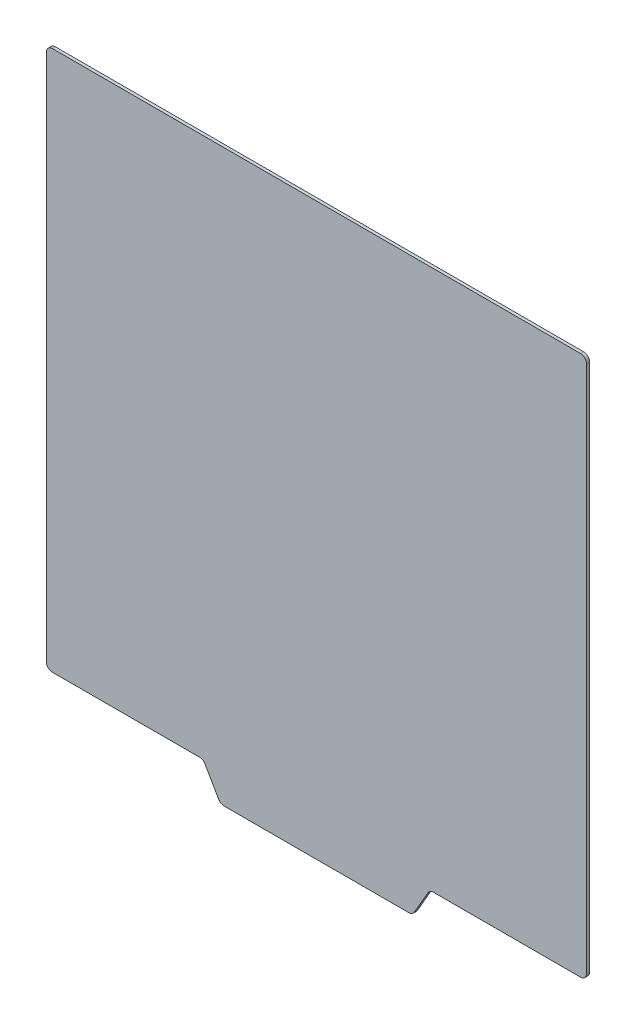
ISO-10303-21;
HEADER;
FILE_DESCRIPTION(('STEP AP214'),'2;1');
FILE_NAME('part.step','',(''),(''),'','','');
FILE_SCHEMA(('AUTOMOTIVE_DESIGN { 1 0 10303 214 1 1 1 1 }'));
ENDSEC;
DATA;
#1=APPLICATION_CONTEXT('core data for automotive mechanical design processes');
#2=APPLICATION_PROTOCOL_DEFINITION('international standard','automotive_design',2000,#1);
#3=PRODUCT_CONTEXT('',#1,'mechanical');
#4=PRODUCT('Part','Part','',(#3));
#5=PRODUCT_RELATED_PRODUCT_CATEGORY('part','',(#4));
#6=PRODUCT_DEFINITION_FORMATION('','',#4);
#7=PRODUCT_DEFINITION_CONTEXT('part definition',#1,'design');
#8=PRODUCT_DEFINITION('design','',#6,#7);
#9=PRODUCT_DEFINITION_SHAPE('','',#8);
#10=(LENGTH_UNIT() NAMED_UNIT(*) SI_UNIT(.MILLI.,.METRE.));
#11=(NAMED_UNIT(*) PLANE_ANGLE_UNIT() SI_UNIT($,.RADIAN.));
#12=(NAMED_UNIT(*) SI_UNIT($,.STERADIAN.) SOLID_ANGLE_UNIT());
#13=UNCERTAINTY_MEASURE_WITH_UNIT(LENGTH_MEASURE(1.E-05),#10,'distance_accuracy_value','');
#14=(GEOMETRIC_REPRESENTATION_CONTEXT(3) GLOBAL_UNCERTAINTY_ASSIGNED_CONTEXT((#13)) GLOBAL_UNIT_ASSIGNED_CONTEXT((#10,
#11,#12)) REPRESENTATION_CONTEXT('',''));
#15=CARTESIAN_POINT('',(0.,0.,0.));
#16=DIRECTION('',(0.,0.,1.));
#17=DIRECTION('',(1.,0.,0.));
#18=AXIS2_PLACEMENT_3D('',#15,#16,#17);
#19=CARTESIAN_POINT('',(-90.,-90.,0.999999999999801));
#20=DIRECTION('',(-1.,0.,0.));
#21=DIRECTION('',(0.,0.,1.));
#22=AXIS2_PLACEMENT_3D('',#19,#20,#21);
#23=PLANE('',#22);
#24=DIRECTION('',(0.,1.,0.));
#25=VECTOR('',#24,1.);
#26=CARTESIAN_POINT('',(-90.,-90.,0.999999999999801));
#27=LINE('',#26,#25);
#28=CARTESIAN_POINT('',(-90.,-88.,0.999999999999805));
#29=VERTEX_POINT('',#28);
#30=CARTESIAN_POINT('',(-90.,88.,1.00000000000014));
#31=VERTEX_POINT('',#30);
#32=EDGE_CURVE('E300',#29,#31,#27,.T.);
#33=ORIENTED_EDGE('',*,*,#32,.T.);
#34=DIRECTION('',(0.,0.,-1.));
#35=VECTOR('',#34,1.);
#36=CARTESIAN_POINT('',(-90.,88.,0.999999999999801));
#37=LINE('',#36,#35);
#38=CARTESIAN_POINT('',(-90.,88.,1.36799954241804E-13));
#39=VERTEX_POINT('',#38);
#40=EDGE_CURVE('E277',#31,#39,#37,.T.);
#41=ORIENTED_EDGE('',*,*,#40,.T.);
#42=DIRECTION('',(0.,1.,0.));
#43=VECTOR('',#42,1.);
#44=CARTESIAN_POINT('',(-90.,-90.,-1.99147411979029E-13));
#45=LINE('',#44,#43);
#46=CARTESIAN_POINT('',(-90.,-88.,-1.9537272247093E-13));
#47=VERTEX_POINT('',#46);
#48=EDGE_CURVE('E38',#47,#39,#45,.T.);
#49=ORIENTED_EDGE('',*,*,#48,.F.);
#50=DIRECTION('',(0.,0.,1.));
#51=VECTOR('',#50,1.);
#52=CARTESIAN_POINT('',(-90.,-88.,0.999999999999801));
#53=LINE('',#52,#51);
#54=EDGE_CURVE('E340',#47,#29,#53,.T.);
#55=ORIENTED_EDGE('',*,*,#54,.T.);
#56=EDGE_LOOP('',(#33,#41,#49,#55));
#57=FACE_BOUND('',#56,.T.);
#58=ADVANCED_FACE('F17',(#57),#23,.T.);
#59=CARTESIAN_POINT('',(-90.,90.,1.00000000000014));
#60=DIRECTION('',(0.,1.,0.));
#61=DIRECTION('',(1.,0.,0.));
#62=AXIS2_PLACEMENT_3D('',#59,#60,#61);
#63=PLANE('',#62);
#64=DIRECTION('',(1.,0.,0.));
#65=VECTOR('',#64,1.);
#66=CARTESIAN_POINT('',(-90.,90.,1.40574643749903E-13));
#67=LINE('',#66,#65);
#68=CARTESIAN_POINT('',(-88.,90.,1.40574643749903E-13));
#69=VERTEX_POINT('',#68);
#70=CARTESIAN_POINT('',(88.,90.,1.40574643749903E-13));
#71=VERTEX_POINT('',#70);
#72=EDGE_CURVE('E49',#69,#71,#67,.T.);
#73=ORIENTED_EDGE('',*,*,#72,.F.);
#74=DIRECTION('',(0.,0.,1.));
#75=VECTOR('',#74,1.);
#76=CARTESIAN_POINT('',(-88.,90.,1.00000000000014));
#77=LINE('',#76,#75);
#78=CARTESIAN_POINT('',(-88.,90.,1.00000000000014));
#79=VERTEX_POINT('',#78);
#80=EDGE_CURVE('E271',#69,#79,#77,.T.);
#81=ORIENTED_EDGE('',*,*,#80,.T.);
#82=DIRECTION('',(1.,0.,0.));
#83=VECTOR('',#82,1.);
#84=CARTESIAN_POINT('',(-90.,90.,1.00000000000014));
#85=LINE('',#84,#83);
#86=CARTESIAN_POINT('',(88.,90.,1.00000000000014));
#87=VERTEX_POINT('',#86);
#88=EDGE_CURVE('E297',#79,#87,#85,.T.);
#89=ORIENTED_EDGE('',*,*,#88,.T.);
#90=DIRECTION('',(0.,0.,-1.));
#91=VECTOR('',#90,1.);
#92=CARTESIAN_POINT('',(88.,90.,1.00000000000014));
#93=LINE('',#92,#91);
#94=EDGE_CURVE('E261',#87,#71,#93,.T.);
#95=ORIENTED_EDGE('',*,*,#94,.T.);
#96=EDGE_LOOP('',(#73,#81,#89,#95));
#97=FACE_BOUND('',#96,.T.);
#98=ADVANCED_FACE('F329',(#97),#63,.T.);
#99=CARTESIAN_POINT('',(90.,90.,1.00000000000014));
#100=DIRECTION('',(1.,0.,0.));
#101=DIRECTION('',(0.,1.,0.));
#102=AXIS2_PLACEMENT_3D('',#99,#100,#101);
#103=PLANE('',#102);
#104=DIRECTION('',(0.,-1.,0.));
#105=VECTOR('',#104,1.);
#106=CARTESIAN_POINT('',(90.,90.,1.40574643749903E-13));
#107=LINE('',#106,#105);
#108=CARTESIAN_POINT('',(90.,88.,1.36799954241804E-13));
#109=VERTEX_POINT('',#108);
#110=CARTESIAN_POINT('',(90.,-88.,-1.9537272247093E-13));
#111=VERTEX_POINT('',#110);
#112=EDGE_CURVE('E288',#109,#111,#107,.T.);
#113=ORIENTED_EDGE('',*,*,#112,.F.);
#114=DIRECTION('',(0.,0.,1.));
#115=VECTOR('',#114,1.);
#116=CARTESIAN_POINT('',(90.,88.,1.00000000000014));
#117=LINE('',#116,#115);
#118=CARTESIAN_POINT('',(90.,88.,1.00000000000014));
#119=VERTEX_POINT('',#118);
#120=EDGE_CURVE('E230',#109,#119,#117,.T.);
#121=ORIENTED_EDGE('',*,*,#120,.T.);
#122=DIRECTION('',(0.,-1.,0.));
#123=VECTOR('',#122,1.);
#124=CARTESIAN_POINT('',(90.,90.,1.00000000000014));
#125=LINE('',#124,#123);
#126=CARTESIAN_POINT('',(90.,-88.,0.999999999999805));
#127=VERTEX_POINT('',#126);
#128=EDGE_CURVE('E11',#119,#127,#125,.T.);
#129=ORIENTED_EDGE('',*,*,#128,.T.);
#130=DIRECTION('',(0.,0.,-1.));
#131=VECTOR('',#130,1.);
#132=CARTESIAN_POINT('',(90.,-88.,1.00000000000014));
#133=LINE('',#132,#131);
#134=EDGE_CURVE('E231',#127,#111,#133,.T.);
#135=ORIENTED_EDGE('',*,*,#134,.T.);
#136=EDGE_LOOP('',(#113,#121,#129,#135));
#137=FACE_BOUND('',#136,.T.);
#138=ADVANCED_FACE('F324',(#137),#103,.T.);
#139=CARTESIAN_POINT('',(90.,-90.,0.999999999999801));
#140=DIRECTION('',(0.,-1.,0.));
#141=DIRECTION('',(0.,0.,-1.));
#142=AXIS2_PLACEMENT_3D('',#139,#140,#141);
#143=PLANE('',#142);
#144=DIRECTION('',(-1.,0.,0.));
#145=VECTOR('',#144,1.);
#146=CARTESIAN_POINT('',(90.,-90.,-1.99147411979029E-13));
#147=LINE('',#146,#145);
#148=CARTESIAN_POINT('',(88.,-90.,-1.99147411979029E-13));
#149=VERTEX_POINT('',#148);
#150=CARTESIAN_POINT('',(38.9282032302755,-90.,-1.99147411979029E-13));
#151=VERTEX_POINT('',#150);
#152=EDGE_CURVE('E291',#149,#151,#147,.T.);
#153=ORIENTED_EDGE('',*,*,#152,.F.);
#154=DIRECTION('',(0.,0.,1.));
#155=VECTOR('',#154,1.);
#156=CARTESIAN_POINT('',(88.,-90.,0.999999999999801));
#157=LINE('',#156,#155);
#158=CARTESIAN_POINT('',(88.,-90.,0.999999999999801));
#159=VERTEX_POINT('',#158);
#160=EDGE_CURVE('E246',#149,#159,#157,.T.);
#161=ORIENTED_EDGE('',*,*,#160,.T.);
#162=DIRECTION('',(-1.,0.,0.));
#163=VECTOR('',#162,1.);
#164=CARTESIAN_POINT('',(90.,-90.,0.999999999999801));
#165=LINE('',#164,#163);
#166=CARTESIAN_POINT('',(38.9282032302755,-90.,0.999999999999801));
#167=VERTEX_POINT('',#166);
#168=EDGE_CURVE('E25',#159,#167,#165,.T.);
#169=ORIENTED_EDGE('',*,*,#168,.T.);
#170=DIRECTION('',(0.,0.,-1.));
#171=VECTOR('',#170,1.);
#172=CARTESIAN_POINT('',(38.9282032302755,-90.,-1.99059518868339E-13));
#173=LINE('',#172,#171);
#174=EDGE_CURVE('E238',#167,#151,#173,.T.);
#175=ORIENTED_EDGE('',*,*,#174,.T.);
#176=EDGE_LOOP('',(#153,#161,#169,#175));
#177=FACE_BOUND('',#176,.T.);
#178=ADVANCED_FACE('F310',(#177),#143,.T.);
#179=CARTESIAN_POINT('',(37.7735026918963,-90.,0.999999999999895));
#180=DIRECTION('',(0.866025403784439,-0.5,0.));
#181=DIRECTION('',(0.,0.,-1.));
#182=AXIS2_PLACEMENT_3D('',#179,#180,#181);
#183=PLANE('',#182);
#184=DIRECTION('',(-0.5,-0.866025403784439,0.));
#185=VECTOR('',#184,1.);
#186=CARTESIAN_POINT('',(37.7735026918963,-90.,-1.05430982812427E-13));
#187=LINE('',#186,#185);
#188=CARTESIAN_POINT('',(37.1961524227066,-91.,-1.07172104797362E-13));
#189=VERTEX_POINT('',#188);
#190=CARTESIAN_POINT('',(32.5773502691896,-99.,-1.21101080676837E-13));
#191=VERTEX_POINT('',#190);
#192=EDGE_CURVE('E294',#189,#191,#187,.T.);
#193=ORIENTED_EDGE('',*,*,#192,.F.);
#194=DIRECTION('',(0.,0.,1.));
#195=VECTOR('',#194,1.);
#196=CARTESIAN_POINT('',(37.1961524227066,-91.,0.999999999999801));
#197=LINE('',#196,#195);
#198=CARTESIAN_POINT('',(37.1961524227066,-91.,0.999999999999893));
#199=VERTEX_POINT('',#198);
#200=EDGE_CURVE('E177',#189,#199,#197,.T.);
#201=ORIENTED_EDGE('',*,*,#200,.T.);
#202=DIRECTION('',(-0.5,-0.866025403784439,0.));
#203=VECTOR('',#202,1.);
#204=CARTESIAN_POINT('',(37.7735026918963,-90.,0.999999999999895));
#205=LINE('',#204,#203);
#206=CARTESIAN_POINT('',(32.5773502691896,-99.,0.999999999999879));
#207=VERTEX_POINT('',#206);
#208=EDGE_CURVE('E171',#199,#207,#205,.T.);
#209=ORIENTED_EDGE('',*,*,#208,.T.);
#210=DIRECTION('',(0.,0.,-1.));
#211=VECTOR('',#210,1.);
#212=CARTESIAN_POINT('',(32.5773502691896,-99.,0.999999999999895));
#213=LINE('',#212,#211);
#214=EDGE_CURVE('E174',#207,#191,#213,.T.);
#215=ORIENTED_EDGE('',*,*,#214,.T.);
#216=EDGE_LOOP('',(#193,#201,#209,#215));
#217=FACE_BOUND('',#216,.T.);
#218=ADVANCED_FACE('F173',(#217),#183,.T.);
#219=CARTESIAN_POINT('',(32.,-100.,0.999999999999877));
#220=DIRECTION('',(0.,-1.,0.));
#221=DIRECTION('',(0.,0.,-1.));
#222=AXIS2_PLACEMENT_3D('',#219,#220,#221);
#223=PLANE('',#222);
#224=DIRECTION('',(-1.,0.,0.));
#225=VECTOR('',#224,1.);
#226=CARTESIAN_POINT('',(32.,-100.,-1.22842202661772E-13));
#227=LINE('',#226,#225);
#228=CARTESIAN_POINT('',(30.8452994616207,-100.,-1.22842202661772E-13));
#229=VERTEX_POINT('',#228);
#230=CARTESIAN_POINT('',(-30.8452994616207,-100.,-1.22842202661772E-13));
#231=VERTEX_POINT('',#230);
#232=EDGE_CURVE('E222',#229,#231,#227,.T.);
#233=ORIENTED_EDGE('',*,*,#232,.F.);
#234=DIRECTION('',(0.,0.,1.));
#235=VECTOR('',#234,1.);
#236=CARTESIAN_POINT('',(30.8452994616207,-100.,0.999999999999877));
#237=LINE('',#236,#235);
#238=CARTESIAN_POINT('',(30.8452994616207,-100.,0.999999999999877));
#239=VERTEX_POINT('',#238);
#240=EDGE_CURVE('E199',#229,#239,#237,.T.);
#241=ORIENTED_EDGE('',*,*,#240,.T.);
#242=DIRECTION('',(-1.,0.,0.));
#243=VECTOR('',#242,1.);
#244=CARTESIAN_POINT('',(32.,-100.,0.999999999999877));
#245=LINE('',#244,#243);
#246=CARTESIAN_POINT('',(-30.8452994616207,-100.,0.999999999999877));
#247=VERTEX_POINT('',#246);
#248=EDGE_CURVE('E183',#239,#247,#245,.T.);
#249=ORIENTED_EDGE('',*,*,#248,.T.);
#250=DIRECTION('',(0.,0.,-1.));
#251=VECTOR('',#250,1.);
#252=CARTESIAN_POINT('',(-30.8452994616207,-100.,0.999999999999877));
#253=LINE('',#252,#251);
#254=EDGE_CURVE('E200',#247,#231,#253,.T.);
#255=ORIENTED_EDGE('',*,*,#254,.T.);
#256=EDGE_LOOP('',(#233,#241,#249,#255));
#257=FACE_BOUND('',#256,.T.);
#258=ADVANCED_FACE('F391',(#257),#223,.T.);
#259=CARTESIAN_POINT('',(-32.,-100.,0.999999999999877));
#260=DIRECTION('',(-0.866025403784439,-0.5,0.));
#261=DIRECTION('',(-0.5,0.866025403784439,0.));
#262=AXIS2_PLACEMENT_3D('',#259,#260,#261);
#263=PLANE('',#262);
#264=DIRECTION('',(-0.5,0.866025403784439,0.));
#265=VECTOR('',#264,1.);
#266=CARTESIAN_POINT('',(-32.,-100.,-1.22842202661772E-13));
#267=LINE('',#266,#265);
#268=CARTESIAN_POINT('',(-32.5773502691896,-99.,-1.21101080676837E-13));
#269=VERTEX_POINT('',#268);
#270=CARTESIAN_POINT('',(-37.1961524227066,-91.,-1.07172104797362E-13));
#271=VERTEX_POINT('',#270);
#272=EDGE_CURVE('E220',#269,#271,#267,.T.);
#273=ORIENTED_EDGE('',*,*,#272,.F.);
#274=DIRECTION('',(0.,0.,1.));
#275=VECTOR('',#274,1.);
#276=CARTESIAN_POINT('',(-32.5773502691896,-99.,0.999999999999877));
#277=LINE('',#276,#275);
#278=CARTESIAN_POINT('',(-32.5773502691896,-99.,0.999999999999879));
#279=VERTEX_POINT('',#278);
#280=EDGE_CURVE('E217',#269,#279,#277,.T.);
#281=ORIENTED_EDGE('',*,*,#280,.T.);
#282=DIRECTION('',(-0.5,0.866025403784439,0.));
#283=VECTOR('',#282,1.);
#284=CARTESIAN_POINT('',(-32.,-100.,0.999999999999877));
#285=LINE('',#284,#283);
#286=CARTESIAN_POINT('',(-37.1961524227066,-91.,0.999999999999893));
#287=VERTEX_POINT('',#286);
#288=EDGE_CURVE('E278',#279,#287,#285,.T.);
#289=ORIENTED_EDGE('',*,*,#288,.T.);
#290=DIRECTION('',(0.,0.,-1.));
#291=VECTOR('',#290,1.);
#292=CARTESIAN_POINT('',(-37.1961524227066,-91.,-1.05384451165591E-13));
#293=LINE('',#292,#291);
#294=EDGE_CURVE('E358',#287,#271,#293,.T.);
#295=ORIENTED_EDGE('',*,*,#294,.T.);
#296=EDGE_LOOP('',(#273,#281,#289,#295));
#297=FACE_BOUND('',#296,.T.);
#298=ADVANCED_FACE('F563',(#297),#263,.T.);
#299=CARTESIAN_POINT('',(-37.7735026918962,-90.,0.999999999999801));
#300=DIRECTION('',(0.,-1.,0.));
#301=DIRECTION('',(-1.,0.,0.));
#302=AXIS2_PLACEMENT_3D('',#299,#300,#301);
#303=PLANE('',#302);
#304=DIRECTION('',(-1.,0.,0.));
#305=VECTOR('',#304,1.);
#306=CARTESIAN_POINT('',(-37.7735026918962,-90.,-1.99147411979029E-13));
#307=LINE('',#306,#305);
#308=CARTESIAN_POINT('',(-38.9282032302755,-90.,-1.99147411979029E-13));
#309=VERTEX_POINT('',#308);
#310=CARTESIAN_POINT('',(-88.,-90.,-1.99147411979029E-13));
#311=VERTEX_POINT('',#310);
#312=EDGE_CURVE('E211',#309,#311,#307,.T.);
#313=ORIENTED_EDGE('',*,*,#312,.F.);
#314=DIRECTION('',(0.,0.,1.));
#315=VECTOR('',#314,1.);
#316=CARTESIAN_POINT('',(-38.9282032302755,-90.,0.999999999999895));
#317=LINE('',#316,#315);
#318=CARTESIAN_POINT('',(-38.9282032302755,-90.,0.999999999999801));
#319=VERTEX_POINT('',#318);
#320=EDGE_CURVE('E367',#309,#319,#317,.T.);
#321=ORIENTED_EDGE('',*,*,#320,.T.);
#322=DIRECTION('',(-1.,0.,0.));
#323=VECTOR('',#322,1.);
#324=CARTESIAN_POINT('',(-37.7735026918962,-90.,0.999999999999801));
#325=LINE('',#324,#323);
#326=CARTESIAN_POINT('',(-88.,-90.,0.999999999999801));
#327=VERTEX_POINT('',#326);
#328=EDGE_CURVE('E281',#319,#327,#325,.T.);
#329=ORIENTED_EDGE('',*,*,#328,.T.);
#330=DIRECTION('',(0.,0.,-1.));
#331=VECTOR('',#330,1.);
#332=CARTESIAN_POINT('',(-88.,-90.,0.999999999999801));
#333=LINE('',#332,#331);
#334=EDGE_CURVE('E351',#327,#311,#333,.T.);
#335=ORIENTED_EDGE('',*,*,#334,.T.);
#336=EDGE_LOOP('',(#313,#321,#329,#335));
#337=FACE_BOUND('',#336,.T.);
#338=ADVANCED_FACE('F558',(#337),#303,.T.);
#339=CARTESIAN_POINT('',(0.,0.,0.999999999999971));
#340=DIRECTION('',(0.,0.,-1.));
#341=DIRECTION('',(-1.,0.,0.));
#342=AXIS2_PLACEMENT_3D('',#339,#340,#341);
#343=PLANE('',#342);
#344=ORIENTED_EDGE('',*,*,#88,.F.);
#345=CARTESIAN_POINT('',(-88.,88.,1.00000000000014));
#346=DIRECTION('',(0.,0.,1.));
#347=DIRECTION('',(0.,1.,0.));
#348=AXIS2_PLACEMENT_3D('',#345,#346,#347);
#349=CIRCLE('',#348,2.);
#350=EDGE_CURVE('E267',#79,#31,#349,.T.);
#351=ORIENTED_EDGE('',*,*,#350,.T.);
#352=ORIENTED_EDGE('',*,*,#32,.F.);
#353=CARTESIAN_POINT('',(-88.,-88.,0.999999999999805));
#354=DIRECTION('',(0.,0.,1.));
#355=DIRECTION('',(0.,1.,0.));
#356=AXIS2_PLACEMENT_3D('',#353,#354,#355);
#357=CIRCLE('',#356,2.);
#358=EDGE_CURVE('E346',#29,#327,#357,.T.);
#359=ORIENTED_EDGE('',*,*,#358,.T.);
#360=ORIENTED_EDGE('',*,*,#328,.F.);
#361=CARTESIAN_POINT('',(-38.9282032302755,-92.,0.999999999999797));
#362=DIRECTION('',(0.,0.,-1.));
#363=DIRECTION('',(0.,1.,0.));
#364=AXIS2_PLACEMENT_3D('',#361,#362,#363);
#365=CIRCLE('',#364,2.);
#366=EDGE_CURVE('E371',#319,#287,#365,.T.);
#367=ORIENTED_EDGE('',*,*,#366,.T.);
#368=ORIENTED_EDGE('',*,*,#288,.F.);
#369=CARTESIAN_POINT('',(-30.8452994616207,-98.,0.999999999999786));
#370=DIRECTION('',(0.,0.,1.));
#371=DIRECTION('',(0.,1.,0.));
#372=AXIS2_PLACEMENT_3D('',#369,#370,#371);
#373=CIRCLE('',#372,2.);
#374=EDGE_CURVE('E362',#279,#247,#373,.T.);
#375=ORIENTED_EDGE('',*,*,#374,.T.);
#376=ORIENTED_EDGE('',*,*,#248,.F.);
#377=CARTESIAN_POINT('',(30.8452994616207,-98.,0.999999999999786));
#378=DIRECTION('',(0.,0.,1.));
#379=DIRECTION('',(0.,1.,0.));
#380=AXIS2_PLACEMENT_3D('',#377,#378,#379);
#381=CIRCLE('',#380,2.);
#382=EDGE_CURVE('E189',#239,#207,#381,.T.);
#383=ORIENTED_EDGE('',*,*,#382,.T.);
#384=ORIENTED_EDGE('',*,*,#208,.F.);
#385=CARTESIAN_POINT('',(38.9282032302755,-92.,0.999999999999797));
#386=DIRECTION('',(0.,0.,-1.));
#387=DIRECTION('',(0.,1.,0.));
#388=AXIS2_PLACEMENT_3D('',#385,#386,#387);
#389=CIRCLE('',#388,2.);
#390=EDGE_CURVE('E193',#199,#167,#389,.T.);
#391=ORIENTED_EDGE('',*,*,#390,.T.);
#392=ORIENTED_EDGE('',*,*,#168,.F.);
#393=CARTESIAN_POINT('',(88.,-88.,0.999999999999805));
#394=DIRECTION('',(0.,0.,1.));
#395=DIRECTION('',(0.,1.,0.));
#396=AXIS2_PLACEMENT_3D('',#393,#394,#395);
#397=CIRCLE('',#396,2.);
#398=EDGE_CURVE('E242',#159,#127,#397,.T.);
#399=ORIENTED_EDGE('',*,*,#398,.T.);
#400=ORIENTED_EDGE('',*,*,#128,.F.);
#401=CARTESIAN_POINT('',(88.,88.,1.00000000000014));
#402=DIRECTION('',(0.,0.,1.));
#403=DIRECTION('',(0.,1.,0.));
#404=AXIS2_PLACEMENT_3D('',#401,#402,#403);
#405=CIRCLE('',#404,2.);
#406=EDGE_CURVE('E226',#119,#87,#405,.T.);
#407=ORIENTED_EDGE('',*,*,#406,.T.);
#408=EDGE_LOOP('',(#344,#351,#352,#359,#360,#367,#368,#375,#376,#383,#384,#391,#392,#399,#400,#407));
#409=FACE_BOUND('',#408,.T.);
#410=ADVANCED_FACE('F195',(#409),#343,.F.);
#411=CARTESIAN_POINT('',(0.,0.,0.));
#412=DIRECTION('',(0.,0.,-1.));
#413=DIRECTION('',(-1.,0.,0.));
#414=AXIS2_PLACEMENT_3D('',#411,#412,#413);
#415=PLANE('',#414);
#416=ORIENTED_EDGE('',*,*,#48,.T.);
#417=CARTESIAN_POINT('',(-88.,88.,1.36826314167671E-13));
#418=DIRECTION('',(0.,0.,-1.));
#419=DIRECTION('',(0.,1.,0.));
#420=AXIS2_PLACEMENT_3D('',#417,#418,#419);
#421=CIRCLE('',#420,2.);
#422=EDGE_CURVE('E274',#39,#69,#421,.T.);
#423=ORIENTED_EDGE('',*,*,#422,.T.);
#424=ORIENTED_EDGE('',*,*,#72,.T.);
#425=CARTESIAN_POINT('',(88.,88.,1.36826314167671E-13));
#426=DIRECTION('',(0.,0.,-1.));
#427=DIRECTION('',(0.,1.,0.));
#428=AXIS2_PLACEMENT_3D('',#425,#426,#427);
#429=CIRCLE('',#428,2.);
#430=EDGE_CURVE('E257',#71,#109,#429,.T.);
#431=ORIENTED_EDGE('',*,*,#430,.T.);
#432=ORIENTED_EDGE('',*,*,#112,.T.);
#433=CARTESIAN_POINT('',(88.,-88.,-1.95373231481888E-13));
#434=DIRECTION('',(0.,0.,-1.));
#435=DIRECTION('',(0.,1.,0.));
#436=AXIS2_PLACEMENT_3D('',#433,#434,#435);
#437=CIRCLE('',#436,2.);
#438=EDGE_CURVE('E250',#111,#149,#437,.T.);
#439=ORIENTED_EDGE('',*,*,#438,.T.);
#440=ORIENTED_EDGE('',*,*,#152,.T.);
#441=CARTESIAN_POINT('',(38.9282032302755,-92.,-2.02962646689286E-13));
#442=DIRECTION('',(0.,0.,1.));
#443=DIRECTION('',(0.,1.,0.));
#444=AXIS2_PLACEMENT_3D('',#441,#442,#443);
#445=CIRCLE('',#444,2.);
#446=EDGE_CURVE('E234',#151,#189,#445,.T.);
#447=ORIENTED_EDGE('',*,*,#446,.T.);
#448=ORIENTED_EDGE('',*,*,#192,.T.);
#449=CARTESIAN_POINT('',(30.8452994616207,-98.,-2.14238349283136E-13));
#450=DIRECTION('',(0.,0.,-1.));
#451=DIRECTION('',(0.,1.,0.));
#452=AXIS2_PLACEMENT_3D('',#449,#450,#451);
#453=CIRCLE('',#452,2.);
#454=EDGE_CURVE('E191',#191,#229,#453,.T.);
#455=ORIENTED_EDGE('',*,*,#454,.T.);
#456=ORIENTED_EDGE('',*,*,#232,.T.);
#457=CARTESIAN_POINT('',(-30.8452994616207,-98.,-2.14238349283136E-13));
#458=DIRECTION('',(0.,0.,-1.));
#459=DIRECTION('',(0.,1.,0.));
#460=AXIS2_PLACEMENT_3D('',#457,#458,#459);
#461=CIRCLE('',#460,2.);
#462=EDGE_CURVE('E208',#231,#269,#461,.T.);
#463=ORIENTED_EDGE('',*,*,#462,.T.);
#464=ORIENTED_EDGE('',*,*,#272,.T.);
#465=CARTESIAN_POINT('',(-38.9282032302755,-92.,-2.02962646689286E-13));
#466=DIRECTION('',(0.,0.,1.));
#467=DIRECTION('',(0.,1.,0.));
#468=AXIS2_PLACEMENT_3D('',#465,#466,#467);
#469=CIRCLE('',#468,2.);
#470=EDGE_CURVE('E363',#271,#309,#469,.T.);
#471=ORIENTED_EDGE('',*,*,#470,.T.);
#472=ORIENTED_EDGE('',*,*,#312,.T.);
#473=CARTESIAN_POINT('',(-88.,-88.,-1.95373231481888E-13));
#474=DIRECTION('',(0.,0.,-1.));
#475=DIRECTION('',(0.,1.,0.));
#476=AXIS2_PLACEMENT_3D('',#473,#474,#475);
#477=CIRCLE('',#476,2.);
#478=EDGE_CURVE('E345',#311,#47,#477,.T.);
#479=ORIENTED_EDGE('',*,*,#478,.T.);
#480=EDGE_LOOP('',(#416,#423,#424,#431,#432,#439,#440,#447,#448,#455,#456,#463,#464,#471,#472,#479));
#481=FACE_BOUND('',#480,.T.);
#482=ADVANCED_FACE('F316',(#481),#415,.T.);
#483=CARTESIAN_POINT('',(-88.,88.,0.999999999999801));
#484=DIRECTION('',(0.,0.,-1.));
#485=DIRECTION('',(-1.,0.,0.));
#486=AXIS2_PLACEMENT_3D('',#483,#484,#485);
#487=CYLINDRICAL_SURFACE('',#486,2.);
#488=ORIENTED_EDGE('',*,*,#350,.F.);
#489=ORIENTED_EDGE('',*,*,#80,.F.);
#490=ORIENTED_EDGE('',*,*,#422,.F.);
#491=ORIENTED_EDGE('',*,*,#40,.F.);
#492=EDGE_LOOP('',(#488,#489,#490,#491));
#493=FACE_BOUND('',#492,.T.);
#494=ADVANCED_FACE('F336',(#493),#487,.T.);
#495=CARTESIAN_POINT('',(88.,88.,1.00000000000014));
#496=DIRECTION('',(0.,0.,-1.));
#497=DIRECTION('',(-1.,0.,0.));
#498=AXIS2_PLACEMENT_3D('',#495,#496,#497);
#499=CYLINDRICAL_SURFACE('',#498,2.);
#500=ORIENTED_EDGE('',*,*,#406,.F.);
#501=ORIENTED_EDGE('',*,*,#120,.F.);
#502=ORIENTED_EDGE('',*,*,#430,.F.);
#503=ORIENTED_EDGE('',*,*,#94,.F.);
#504=EDGE_LOOP('',(#500,#501,#502,#503));
#505=FACE_BOUND('',#504,.T.);
#506=ADVANCED_FACE('F328',(#505),#499,.T.);
#507=CARTESIAN_POINT('',(88.,-88.,1.00000000000014));
#508=DIRECTION('',(0.,0.,-1.));
#509=DIRECTION('',(-1.,0.,0.));
#510=AXIS2_PLACEMENT_3D('',#507,#508,#509);
#511=CYLINDRICAL_SURFACE('',#510,2.);
#512=ORIENTED_EDGE('',*,*,#398,.F.);
#513=ORIENTED_EDGE('',*,*,#160,.F.);
#514=ORIENTED_EDGE('',*,*,#438,.F.);
#515=ORIENTED_EDGE('',*,*,#134,.F.);
#516=EDGE_LOOP('',(#512,#513,#514,#515));
#517=FACE_BOUND('',#516,.T.);
#518=ADVANCED_FACE('F320',(#517),#511,.T.);
#519=CARTESIAN_POINT('',(38.9282032302755,-92.,0.999999999999801));
#520=DIRECTION('',(0.,0.,1.));
#521=DIRECTION('',(1.,0.,0.));
#522=AXIS2_PLACEMENT_3D('',#519,#520,#521);
#523=CYLINDRICAL_SURFACE('',#522,2.);
#524=ORIENTED_EDGE('',*,*,#390,.F.);
#525=ORIENTED_EDGE('',*,*,#200,.F.);
#526=ORIENTED_EDGE('',*,*,#446,.F.);
#527=ORIENTED_EDGE('',*,*,#174,.F.);
#528=EDGE_LOOP('',(#524,#525,#526,#527));
#529=FACE_BOUND('',#528,.T.);
#530=ADVANCED_FACE('F315',(#529),#523,.F.);
#531=CARTESIAN_POINT('',(30.8452994616207,-98.,0.999999999999895));
#532=DIRECTION('',(0.,0.,-1.));
#533=DIRECTION('',(-1.,0.,0.));
#534=AXIS2_PLACEMENT_3D('',#531,#532,#533);
#535=CYLINDRICAL_SURFACE('',#534,2.);
#536=ORIENTED_EDGE('',*,*,#382,.F.);
#537=ORIENTED_EDGE('',*,*,#240,.F.);
#538=ORIENTED_EDGE('',*,*,#454,.F.);
#539=ORIENTED_EDGE('',*,*,#214,.F.);
#540=EDGE_LOOP('',(#536,#537,#538,#539));
#541=FACE_BOUND('',#540,.T.);
#542=ADVANCED_FACE('F187',(#541),#535,.T.);
#543=CARTESIAN_POINT('',(-30.8452994616207,-98.,0.999999999999877));
#544=DIRECTION('',(0.,0.,-1.));
#545=DIRECTION('',(-1.,0.,0.));
#546=AXIS2_PLACEMENT_3D('',#543,#544,#545);
#547=CYLINDRICAL_SURFACE('',#546,2.);
#548=ORIENTED_EDGE('',*,*,#374,.F.);
#549=ORIENTED_EDGE('',*,*,#280,.F.);
#550=ORIENTED_EDGE('',*,*,#462,.F.);
#551=ORIENTED_EDGE('',*,*,#254,.F.);
#552=EDGE_LOOP('',(#548,#549,#550,#551));
#553=FACE_BOUND('',#552,.T.);
#554=ADVANCED_FACE('F388',(#553),#547,.T.);
#555=CARTESIAN_POINT('',(-38.9282032302755,-92.,0.999999999999877));
#556=DIRECTION('',(0.,0.,1.));
#557=DIRECTION('',(1.,0.,0.));
#558=AXIS2_PLACEMENT_3D('',#555,#556,#557);
#559=CYLINDRICAL_SURFACE('',#558,2.);
#560=ORIENTED_EDGE('',*,*,#366,.F.);
#561=ORIENTED_EDGE('',*,*,#320,.F.);
#562=ORIENTED_EDGE('',*,*,#470,.F.);
#563=ORIENTED_EDGE('',*,*,#294,.F.);
#564=EDGE_LOOP('',(#560,#561,#562,#563));
#565=FACE_BOUND('',#564,.T.);
#566=ADVANCED_FACE('F562',(#565),#559,.F.);
#567=CARTESIAN_POINT('',(-88.,-88.,0.999999999999801));
#568=DIRECTION('',(0.,0.,-1.));
#569=DIRECTION('',(-1.,0.,0.));
#570=AXIS2_PLACEMENT_3D('',#567,#568,#569);
#571=CYLINDRICAL_SURFACE('',#570,2.);
#572=ORIENTED_EDGE('',*,*,#358,.F.);
#573=ORIENTED_EDGE('',*,*,#54,.F.);
#574=ORIENTED_EDGE('',*,*,#478,.F.);
#575=ORIENTED_EDGE('',*,*,#334,.F.);
#576=EDGE_LOOP('',(#572,#573,#574,#575));
#577=FACE_BOUND('',#576,.T.);
#578=ADVANCED_FACE('F349',(#577),#571,.T.);
#579=CLOSED_SHELL('',(#58,#98,#138,#178,#218,#258,#298,#338,#410,#482,#494,#506,#518,#530,#542,
#554,#566,#578));
#580=MANIFOLD_SOLID_BREP('B1',#579);
#581=ADVANCED_BREP_SHAPE_REPRESENTATION('',(#18,#580),#14);
#582=SHAPE_DEFINITION_REPRESENTATION(#9,#581);
ENDSEC;
END-ISO-10303-21;
